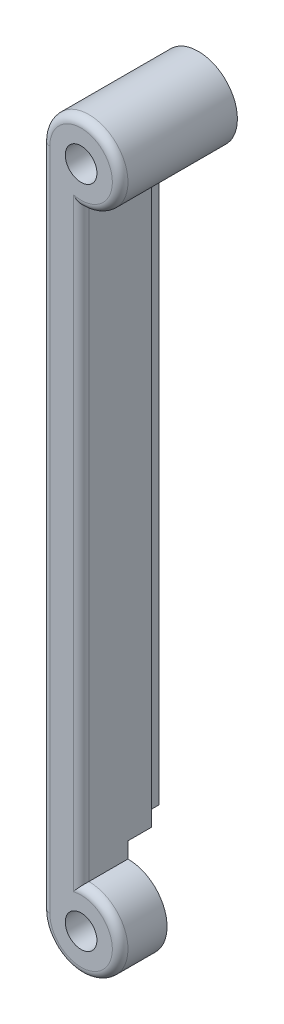
ISO-10303-21;
HEADER;
FILE_DESCRIPTION(('STEP AP214'),'2;1');
FILE_NAME('part.step','',(''),(''),'','','');
FILE_SCHEMA(('AUTOMOTIVE_DESIGN { 1 0 10303 214 1 1 1 1 }'));
ENDSEC;
DATA;
#1=APPLICATION_CONTEXT('core data for automotive mechanical design processes');
#2=APPLICATION_PROTOCOL_DEFINITION('international standard','automotive_design',2000,#1);
#3=PRODUCT_CONTEXT('',#1,'mechanical');
#4=PRODUCT('Part','Part','',(#3));
#5=PRODUCT_RELATED_PRODUCT_CATEGORY('part','',(#4));
#6=PRODUCT_DEFINITION_FORMATION('','',#4);
#7=PRODUCT_DEFINITION_CONTEXT('part definition',#1,'design');
#8=PRODUCT_DEFINITION('design','',#6,#7);
#9=PRODUCT_DEFINITION_SHAPE('','',#8);
#10=(LENGTH_UNIT() NAMED_UNIT(*) SI_UNIT(.MILLI.,.METRE.));
#11=(NAMED_UNIT(*) PLANE_ANGLE_UNIT() SI_UNIT($,.RADIAN.));
#12=(NAMED_UNIT(*) SI_UNIT($,.STERADIAN.) SOLID_ANGLE_UNIT());
#13=UNCERTAINTY_MEASURE_WITH_UNIT(LENGTH_MEASURE(1.E-05),#10,'distance_accuracy_value','');
#14=(GEOMETRIC_REPRESENTATION_CONTEXT(3) GLOBAL_UNCERTAINTY_ASSIGNED_CONTEXT((#13)) GLOBAL_UNIT_ASSIGNED_CONTEXT((#10,
#11,#12)) REPRESENTATION_CONTEXT('',''));
#15=CARTESIAN_POINT('',(0.,0.,0.));
#16=DIRECTION('',(0.,0.,1.));
#17=DIRECTION('',(1.,0.,0.));
#18=AXIS2_PLACEMENT_3D('',#15,#16,#17);
#19=CARTESIAN_POINT('',(0.,85.,9.));
#20=DIRECTION('',(0.,0.,-1.));
#21=DIRECTION('',(-1.,0.,0.));
#22=AXIS2_PLACEMENT_3D('',#19,#20,#21);
#23=CYLINDRICAL_SURFACE('',#22,5.00000000000001);
#24=CARTESIAN_POINT('',(0.,85.,-6.));
#25=DIRECTION('',(0.,0.,1.));
#26=DIRECTION('',(1.,0.,0.));
#27=AXIS2_PLACEMENT_3D('',#24,#25,#26);
#28=CIRCLE('',#27,5.);
#29=CARTESIAN_POINT('',(5.,85.,-6.));
#30=VERTEX_POINT('',#29);
#31=EDGE_CURVE('E176',#30,#30,#28,.T.);
#32=ORIENTED_EDGE('',*,*,#31,.T.);
#33=EDGE_LOOP('',(#32));
#34=FACE_BOUND('',#33,.T.);
#35=DIRECTION('',(0.,0.,-1.));
#36=VECTOR('',#35,1.);
#37=CARTESIAN_POINT('',(-5.,85.,9.));
#38=LINE('',#37,#36);
#39=CARTESIAN_POINT('',(-5.,85.,8.));
#40=VERTEX_POINT('',#39);
#41=CARTESIAN_POINT('',(-5.,85.,-3.));
#42=VERTEX_POINT('',#41);
#43=EDGE_CURVE('E190',#40,#42,#38,.T.);
#44=ORIENTED_EDGE('',*,*,#43,.F.);
#45=CARTESIAN_POINT('',(0.,85.,8.));
#46=DIRECTION('',(0.,0.,1.));
#47=DIRECTION('',(1.,0.,0.));
#48=AXIS2_PLACEMENT_3D('',#45,#46,#47);
#49=CIRCLE('',#48,5.00000000000001);
#50=CARTESIAN_POINT('',(0.,80.,8.));
#51=VERTEX_POINT('',#50);
#52=EDGE_CURVE('E261',#40,#51,#49,.F.);
#53=ORIENTED_EDGE('',*,*,#52,.T.);
#54=DIRECTION('',(0.,0.,-1.));
#55=VECTOR('',#54,1.);
#56=CARTESIAN_POINT('',(0.,80.,9.));
#57=LINE('',#56,#55);
#58=CARTESIAN_POINT('',(0.,80.,-0.999999999999999));
#59=VERTEX_POINT('',#58);
#60=EDGE_CURVE('E192',#51,#59,#57,.T.);
#61=ORIENTED_EDGE('',*,*,#60,.T.);
#62=CARTESIAN_POINT('',(0.,85.,-0.999999999999999));
#63=DIRECTION('',(0.,0.,1.));
#64=DIRECTION('',(1.,0.,0.));
#65=AXIS2_PLACEMENT_3D('',#62,#63,#64);
#66=CIRCLE('',#65,5.00000000000001);
#67=CARTESIAN_POINT('',(-2.,80.4174243050442,-0.999999999999999));
#68=VERTEX_POINT('',#67);
#69=EDGE_CURVE('E207',#59,#68,#66,.F.);
#70=ORIENTED_EDGE('',*,*,#69,.T.);
#71=DIRECTION('',(0.,0.,1.));
#72=VECTOR('',#71,1.);
#73=CARTESIAN_POINT('',(-2.,80.4174243050442,-3.));
#74=LINE('',#73,#72);
#75=CARTESIAN_POINT('',(-2.,80.4174243050442,-3.));
#76=VERTEX_POINT('',#75);
#77=EDGE_CURVE('E170',#76,#68,#74,.T.);
#78=ORIENTED_EDGE('',*,*,#77,.F.);
#79=CARTESIAN_POINT('',(0.,85.,-3.));
#80=DIRECTION('',(0.,0.,-1.));
#81=DIRECTION('',(1.,0.,0.));
#82=AXIS2_PLACEMENT_3D('',#79,#80,#81);
#83=CIRCLE('',#82,5.00000000000001);
#84=EDGE_CURVE('E166',#76,#42,#83,.T.);
#85=ORIENTED_EDGE('',*,*,#84,.T.);
#86=EDGE_LOOP('',(#44,#53,#61,#70,#78,#85));
#87=FACE_BOUND('',#86,.T.);
#88=ADVANCED_FACE('F34',(#34,#87),#23,.T.);
#89=CARTESIAN_POINT('',(0.,0.,9.));
#90=DIRECTION('',(0.,0.,1.));
#91=DIRECTION('',(1.,0.,0.));
#92=AXIS2_PLACEMENT_3D('',#89,#90,#91);
#93=PLANE('',#92);
#94=CARTESIAN_POINT('',(0.,85.,9.));
#95=DIRECTION('',(0.,0.,1.));
#96=DIRECTION('',(1.,0.,0.));
#97=AXIS2_PLACEMENT_3D('',#94,#95,#96);
#98=CIRCLE('',#97,4.00000000000001);
#99=CARTESIAN_POINT('',(-1.,81.1270166537926,9.));
#100=VERTEX_POINT('',#99);
#101=CARTESIAN_POINT('',(-4.00000000000001,85.,9.));
#102=VERTEX_POINT('',#101);
#103=EDGE_CURVE('E268',#100,#102,#98,.T.);
#104=ORIENTED_EDGE('',*,*,#103,.T.);
#105=DIRECTION('',(0.,-1.,0.));
#106=VECTOR('',#105,1.);
#107=CARTESIAN_POINT('',(-4.,0.,9.));
#108=LINE('',#107,#106);
#109=CARTESIAN_POINT('',(-4.,0.,9.));
#110=VERTEX_POINT('',#109);
#111=EDGE_CURVE('E264',#102,#110,#108,.T.);
#112=ORIENTED_EDGE('',*,*,#111,.T.);
#113=CARTESIAN_POINT('',(0.,0.,9.));
#114=DIRECTION('',(0.,0.,1.));
#115=DIRECTION('',(1.,0.,0.));
#116=AXIS2_PLACEMENT_3D('',#113,#114,#115);
#117=CIRCLE('',#116,4.);
#118=CARTESIAN_POINT('',(-1.,3.87298334620742,9.));
#119=VERTEX_POINT('',#118);
#120=EDGE_CURVE('E260',#110,#119,#117,.T.);
#121=ORIENTED_EDGE('',*,*,#120,.T.);
#122=DIRECTION('',(0.,1.,0.));
#123=VECTOR('',#122,1.);
#124=CARTESIAN_POINT('',(-1.,80.,9.));
#125=LINE('',#124,#123);
#126=EDGE_CURVE('E214',#119,#100,#125,.T.);
#127=ORIENTED_EDGE('',*,*,#126,.T.);
#128=EDGE_LOOP('',(#104,#112,#121,#127));
#129=FACE_BOUND('',#128,.T.);
#130=CARTESIAN_POINT('',(0.,85.,9.));
#131=DIRECTION('',(0.,0.,1.));
#132=DIRECTION('',(1.,0.,0.));
#133=AXIS2_PLACEMENT_3D('',#130,#131,#132);
#134=CIRCLE('',#133,2.025);
#135=CARTESIAN_POINT('',(2.025,85.,9.));
#136=VERTEX_POINT('',#135);
#137=EDGE_CURVE('E182',#136,#136,#134,.T.);
#138=ORIENTED_EDGE('',*,*,#137,.F.);
#139=EDGE_LOOP('',(#138));
#140=FACE_BOUND('',#139,.T.);
#141=CARTESIAN_POINT('',(0.,0.,9.));
#142=DIRECTION('',(0.,0.,1.));
#143=DIRECTION('',(1.,0.,0.));
#144=AXIS2_PLACEMENT_3D('',#141,#142,#143);
#145=CIRCLE('',#144,2.025);
#146=CARTESIAN_POINT('',(2.025,0.,9.));
#147=VERTEX_POINT('',#146);
#148=EDGE_CURVE('E179',#147,#147,#145,.T.);
#149=ORIENTED_EDGE('',*,*,#148,.F.);
#150=EDGE_LOOP('',(#149));
#151=FACE_BOUND('',#150,.T.);
#152=ADVANCED_FACE('F271',(#129,#140,#151),#93,.T.);
#153=CARTESIAN_POINT('',(0.,0.,0.));
#154=DIRECTION('',(0.,0.,1.));
#155=DIRECTION('',(1.,0.,0.));
#156=AXIS2_PLACEMENT_3D('',#153,#154,#155);
#157=PLANE('',#156);
#158=DIRECTION('',(-1.,0.,0.));
#159=VECTOR('',#158,1.);
#160=CARTESIAN_POINT('',(0.,7.01125174005379,0.));
#161=LINE('',#160,#159);
#162=CARTESIAN_POINT('',(0.,7.01125174005379,0.));
#163=VERTEX_POINT('',#162);
#164=CARTESIAN_POINT('',(-0.999999999999996,7.01125174005379,0.));
#165=VERTEX_POINT('',#164);
#166=EDGE_CURVE('E156',#163,#165,#161,.T.);
#167=ORIENTED_EDGE('',*,*,#166,.T.);
#168=DIRECTION('',(0.,1.,0.));
#169=VECTOR('',#168,1.);
#170=CARTESIAN_POINT('',(-0.999999999999995,0.,0.));
#171=LINE('',#170,#169);
#172=CARTESIAN_POINT('',(-1.,79.0839202169004,0.));
#173=VERTEX_POINT('',#172);
#174=EDGE_CURVE('E202',#165,#173,#171,.T.);
#175=ORIENTED_EDGE('',*,*,#174,.T.);
#176=CARTESIAN_POINT('',(0.,85.,0.));
#177=DIRECTION('',(0.,0.,1.));
#178=DIRECTION('',(1.,0.,0.));
#179=AXIS2_PLACEMENT_3D('',#176,#177,#178);
#180=CIRCLE('',#179,6.00000000000001);
#181=CARTESIAN_POINT('',(0.,79.,0.));
#182=VERTEX_POINT('',#181);
#183=EDGE_CURVE('E198',#173,#182,#180,.T.);
#184=ORIENTED_EDGE('',*,*,#183,.T.);
#185=DIRECTION('',(0.,1.,0.));
#186=VECTOR('',#185,1.);
#187=CARTESIAN_POINT('',(0.,5.,0.));
#188=LINE('',#187,#186);
#189=EDGE_CURVE('E185',#163,#182,#188,.T.);
#190=ORIENTED_EDGE('',*,*,#189,.F.);
#191=EDGE_LOOP('',(#167,#175,#184,#190));
#192=FACE_BOUND('',#191,.T.);
#193=ADVANCED_FACE('F286',(#192),#157,.F.);
#194=CARTESIAN_POINT('',(0.,0.,9.));
#195=DIRECTION('',(0.,0.,-1.));
#196=DIRECTION('',(-1.,0.,0.));
#197=AXIS2_PLACEMENT_3D('',#194,#195,#196);
#198=CYLINDRICAL_SURFACE('',#197,5.);
#199=DIRECTION('',(0.,0.,-1.));
#200=VECTOR('',#199,1.);
#201=CARTESIAN_POINT('',(0.,5.,9.));
#202=LINE('',#201,#200);
#203=CARTESIAN_POINT('',(0.,5.,8.));
#204=VERTEX_POINT('',#203);
#205=CARTESIAN_POINT('',(0.,5.,3.));
#206=VERTEX_POINT('',#205);
#207=EDGE_CURVE('E194',#204,#206,#202,.T.);
#208=ORIENTED_EDGE('',*,*,#207,.F.);
#209=CARTESIAN_POINT('',(0.,0.,8.));
#210=DIRECTION('',(0.,0.,1.));
#211=DIRECTION('',(1.,0.,0.));
#212=AXIS2_PLACEMENT_3D('',#209,#210,#211);
#213=CIRCLE('',#212,5.);
#214=CARTESIAN_POINT('',(-5.,0.,8.));
#215=VERTEX_POINT('',#214);
#216=EDGE_CURVE('E57',#204,#215,#213,.F.);
#217=ORIENTED_EDGE('',*,*,#216,.T.);
#218=DIRECTION('',(0.,0.,-1.));
#219=VECTOR('',#218,1.);
#220=CARTESIAN_POINT('',(-5.,0.,9.));
#221=LINE('',#220,#219);
#222=CARTESIAN_POINT('',(-5.,0.,3.));
#223=VERTEX_POINT('',#222);
#224=EDGE_CURVE('E188',#215,#223,#221,.T.);
#225=ORIENTED_EDGE('',*,*,#224,.T.);
#226=CARTESIAN_POINT('',(0.,0.,3.));
#227=DIRECTION('',(0.,0.,1.));
#228=DIRECTION('',(0.,-1.,0.));
#229=AXIS2_PLACEMENT_3D('',#226,#227,#228);
#230=CIRCLE('',#229,5.);
#231=EDGE_CURVE('E144',#223,#206,#230,.T.);
#232=ORIENTED_EDGE('',*,*,#231,.T.);
#233=EDGE_LOOP('',(#208,#217,#225,#232));
#234=FACE_BOUND('',#233,.T.);
#235=ADVANCED_FACE('F294',(#234),#198,.T.);
#236=CARTESIAN_POINT('',(0.,5.,9.));
#237=DIRECTION('',(-1.,0.,0.));
#238=DIRECTION('',(0.,0.,1.));
#239=AXIS2_PLACEMENT_3D('',#236,#237,#238);
#240=PLANE('',#239);
#241=ORIENTED_EDGE('',*,*,#60,.F.);
#242=DIRECTION('',(0.,1.,0.));
#243=VECTOR('',#242,1.);
#244=CARTESIAN_POINT('',(0.,5.,8.));
#245=LINE('',#244,#243);
#246=EDGE_CURVE('E11',#51,#204,#245,.F.);
#247=ORIENTED_EDGE('',*,*,#246,.T.);
#248=ORIENTED_EDGE('',*,*,#207,.T.);
#249=DIRECTION('',(0.,1.,0.));
#250=VECTOR('',#249,1.);
#251=CARTESIAN_POINT('',(0.,5.,3.));
#252=LINE('',#251,#250);
#253=CARTESIAN_POINT('',(0.,7.01125174005379,3.));
#254=VERTEX_POINT('',#253);
#255=EDGE_CURVE('E161',#206,#254,#252,.T.);
#256=ORIENTED_EDGE('',*,*,#255,.T.);
#257=DIRECTION('',(0.,0.,-1.));
#258=VECTOR('',#257,1.);
#259=CARTESIAN_POINT('',(0.,7.01125174005379,9.));
#260=LINE('',#259,#258);
#261=EDGE_CURVE('E133',#254,#163,#260,.T.);
#262=ORIENTED_EDGE('',*,*,#261,.T.);
#263=ORIENTED_EDGE('',*,*,#189,.T.);
#264=CARTESIAN_POINT('',(0.,79.,-0.999999999999999));
#265=DIRECTION('',(-1.,0.,0.));
#266=DIRECTION('',(0.,0.,1.));
#267=AXIS2_PLACEMENT_3D('',#264,#265,#266);
#268=CIRCLE('',#267,1.);
#269=EDGE_CURVE('E211',#182,#59,#268,.T.);
#270=ORIENTED_EDGE('',*,*,#269,.T.);
#271=EDGE_LOOP('',(#241,#247,#248,#256,#262,#263,#270));
#272=FACE_BOUND('',#271,.T.);
#273=ADVANCED_FACE('F292',(#272),#240,.F.);
#274=CARTESIAN_POINT('',(-5.,0.,9.));
#275=DIRECTION('',(1.,0.,0.));
#276=DIRECTION('',(0.,1.,0.));
#277=AXIS2_PLACEMENT_3D('',#274,#275,#276);
#278=PLANE('',#277);
#279=ORIENTED_EDGE('',*,*,#224,.F.);
#280=DIRECTION('',(0.,-1.,0.));
#281=VECTOR('',#280,1.);
#282=CARTESIAN_POINT('',(-5.,85.,8.));
#283=LINE('',#282,#281);
#284=EDGE_CURVE('E49',#215,#40,#283,.F.);
#285=ORIENTED_EDGE('',*,*,#284,.T.);
#286=ORIENTED_EDGE('',*,*,#43,.T.);
#287=DIRECTION('',(0.,-1.,0.));
#288=VECTOR('',#287,1.);
#289=CARTESIAN_POINT('',(-5.,0.,-3.));
#290=LINE('',#289,#288);
#291=CARTESIAN_POINT('',(-5.,7.01125174005379,-3.));
#292=VERTEX_POINT('',#291);
#293=EDGE_CURVE('E151',#42,#292,#290,.T.);
#294=ORIENTED_EDGE('',*,*,#293,.T.);
#295=DIRECTION('',(0.,0.,-1.));
#296=VECTOR('',#295,1.);
#297=CARTESIAN_POINT('',(-5.,7.01125174005379,3.));
#298=LINE('',#297,#296);
#299=CARTESIAN_POINT('',(-5.,7.01125174005379,3.));
#300=VERTEX_POINT('',#299);
#301=EDGE_CURVE('E130',#300,#292,#298,.T.);
#302=ORIENTED_EDGE('',*,*,#301,.F.);
#303=DIRECTION('',(0.,1.,0.));
#304=VECTOR('',#303,1.);
#305=CARTESIAN_POINT('',(-5.,7.01125174005379,3.));
#306=LINE('',#305,#304);
#307=EDGE_CURVE('E141',#223,#300,#306,.T.);
#308=ORIENTED_EDGE('',*,*,#307,.F.);
#309=EDGE_LOOP('',(#279,#285,#286,#294,#302,#308));
#310=FACE_BOUND('',#309,.T.);
#311=ADVANCED_FACE('F149',(#310),#278,.F.);
#312=CARTESIAN_POINT('',(0.,85.,9.));
#313=DIRECTION('',(0.,0.,-1.));
#314=DIRECTION('',(-1.,0.,0.));
#315=AXIS2_PLACEMENT_3D('',#312,#313,#314);
#316=CYLINDRICAL_SURFACE('',#315,2.025);
#317=ORIENTED_EDGE('',*,*,#137,.T.);
#318=EDGE_LOOP('',(#317));
#319=FACE_BOUND('',#318,.T.);
#320=CARTESIAN_POINT('',(0.,85.,-6.));
#321=DIRECTION('',(0.,0.,1.));
#322=DIRECTION('',(1.,0.,0.));
#323=AXIS2_PLACEMENT_3D('',#320,#321,#322);
#324=CIRCLE('',#323,2.025);
#325=CARTESIAN_POINT('',(2.025,85.,-6.));
#326=VERTEX_POINT('',#325);
#327=EDGE_CURVE('E173',#326,#326,#324,.T.);
#328=ORIENTED_EDGE('',*,*,#327,.F.);
#329=EDGE_LOOP('',(#328));
#330=FACE_BOUND('',#329,.T.);
#331=ADVANCED_FACE('F333',(#319,#330),#316,.F.);
#332=CARTESIAN_POINT('',(0.,0.,9.));
#333=DIRECTION('',(0.,0.,-1.));
#334=DIRECTION('',(-1.,0.,0.));
#335=AXIS2_PLACEMENT_3D('',#332,#333,#334);
#336=CYLINDRICAL_SURFACE('',#335,2.025);
#337=CARTESIAN_POINT('',(0.,0.,3.));
#338=DIRECTION('',(0.,0.,1.));
#339=DIRECTION('',(0.,-1.,0.));
#340=AXIS2_PLACEMENT_3D('',#337,#338,#339);
#341=CIRCLE('',#340,2.025);
#342=CARTESIAN_POINT('',(0.,-2.025,3.));
#343=VERTEX_POINT('',#342);
#344=EDGE_CURVE('E160',#343,#343,#341,.T.);
#345=ORIENTED_EDGE('',*,*,#344,.F.);
#346=EDGE_LOOP('',(#345));
#347=FACE_BOUND('',#346,.T.);
#348=ORIENTED_EDGE('',*,*,#148,.T.);
#349=EDGE_LOOP('',(#348));
#350=FACE_BOUND('',#349,.T.);
#351=ADVANCED_FACE('F326',(#347,#350),#336,.F.);
#352=CARTESIAN_POINT('',(0.,85.,-6.));
#353=DIRECTION('',(0.,0.,1.));
#354=DIRECTION('',(1.,0.,0.));
#355=AXIS2_PLACEMENT_3D('',#352,#353,#354);
#356=PLANE('',#355);
#357=ORIENTED_EDGE('',*,*,#327,.T.);
#358=EDGE_LOOP('',(#357));
#359=FACE_BOUND('',#358,.T.);
#360=ORIENTED_EDGE('',*,*,#31,.F.);
#361=EDGE_LOOP('',(#360));
#362=FACE_BOUND('',#361,.T.);
#363=ADVANCED_FACE('F319',(#359,#362),#356,.F.);
#364=CARTESIAN_POINT('',(-2.,80.4174243050442,-3.));
#365=DIRECTION('',(1.,0.,0.));
#366=DIRECTION('',(0.,1.,0.));
#367=AXIS2_PLACEMENT_3D('',#364,#365,#366);
#368=PLANE('',#367);
#369=ORIENTED_EDGE('',*,*,#77,.T.);
#370=DIRECTION('',(0.,1.,0.));
#371=VECTOR('',#370,1.);
#372=CARTESIAN_POINT('',(-2.,80.4174243050442,-1.));
#373=LINE('',#372,#371);
#374=CARTESIAN_POINT('',(-2.,7.01125174005379,-1.));
#375=VERTEX_POINT('',#374);
#376=EDGE_CURVE('E205',#68,#375,#373,.F.);
#377=ORIENTED_EDGE('',*,*,#376,.T.);
#378=DIRECTION('',(0.,0.,1.));
#379=VECTOR('',#378,1.);
#380=CARTESIAN_POINT('',(-2.,7.01125174005379,-2.99999999999999));
#381=LINE('',#380,#379);
#382=CARTESIAN_POINT('',(-2.,7.01125174005379,-3.));
#383=VERTEX_POINT('',#382);
#384=EDGE_CURVE('E137',#383,#375,#381,.T.);
#385=ORIENTED_EDGE('',*,*,#384,.F.);
#386=DIRECTION('',(0.,1.,0.));
#387=VECTOR('',#386,1.);
#388=CARTESIAN_POINT('',(-2.,80.4174243050442,-3.));
#389=LINE('',#388,#387);
#390=EDGE_CURVE('E164',#383,#76,#389,.T.);
#391=ORIENTED_EDGE('',*,*,#390,.T.);
#392=EDGE_LOOP('',(#369,#377,#385,#391));
#393=FACE_BOUND('',#392,.T.);
#394=ADVANCED_FACE('F316',(#393),#368,.T.);
#395=CARTESIAN_POINT('',(0.,0.,-3.));
#396=DIRECTION('',(0.,0.,-1.));
#397=DIRECTION('',(-1.,0.,0.));
#398=AXIS2_PLACEMENT_3D('',#395,#396,#397);
#399=PLANE('',#398);
#400=DIRECTION('',(1.,0.,0.));
#401=VECTOR('',#400,1.);
#402=CARTESIAN_POINT('',(0.,7.01125174005379,-3.));
#403=LINE('',#402,#401);
#404=EDGE_CURVE('E196',#292,#383,#403,.T.);
#405=ORIENTED_EDGE('',*,*,#404,.F.);
#406=ORIENTED_EDGE('',*,*,#293,.F.);
#407=ORIENTED_EDGE('',*,*,#84,.F.);
#408=ORIENTED_EDGE('',*,*,#390,.F.);
#409=EDGE_LOOP('',(#405,#406,#407,#408));
#410=FACE_BOUND('',#409,.T.);
#411=ADVANCED_FACE('F311',(#410),#399,.T.);
#412=CARTESIAN_POINT('',(5.,7.01125174005379,3.));
#413=DIRECTION('',(0.,0.,1.));
#414=DIRECTION('',(0.,-1.,0.));
#415=AXIS2_PLACEMENT_3D('',#412,#413,#414);
#416=PLANE('',#415);
#417=ORIENTED_EDGE('',*,*,#344,.T.);
#418=EDGE_LOOP('',(#417));
#419=FACE_BOUND('',#418,.T.);
#420=ORIENTED_EDGE('',*,*,#307,.T.);
#421=DIRECTION('',(-1.,0.,0.));
#422=VECTOR('',#421,1.);
#423=CARTESIAN_POINT('',(5.,7.01125174005379,3.));
#424=LINE('',#423,#422);
#425=EDGE_CURVE('E126',#254,#300,#424,.T.);
#426=ORIENTED_EDGE('',*,*,#425,.F.);
#427=ORIENTED_EDGE('',*,*,#255,.F.);
#428=ORIENTED_EDGE('',*,*,#231,.F.);
#429=EDGE_LOOP('',(#420,#426,#427,#428));
#430=FACE_BOUND('',#429,.T.);
#431=ADVANCED_FACE('F142',(#419,#430),#416,.F.);
#432=CARTESIAN_POINT('',(5.,7.01125174005379,3.));
#433=DIRECTION('',(0.,1.,0.));
#434=DIRECTION('',(0.,0.,1.));
#435=AXIS2_PLACEMENT_3D('',#432,#433,#434);
#436=PLANE('',#435);
#437=ORIENTED_EDGE('',*,*,#425,.T.);
#438=ORIENTED_EDGE('',*,*,#301,.T.);
#439=ORIENTED_EDGE('',*,*,#404,.T.);
#440=ORIENTED_EDGE('',*,*,#384,.T.);
#441=CARTESIAN_POINT('',(-0.999999999999996,7.01125174005379,-1.));
#442=DIRECTION('',(0.,1.,0.));
#443=DIRECTION('',(0.,0.,1.));
#444=AXIS2_PLACEMENT_3D('',#441,#442,#443);
#445=CIRCLE('',#444,1.);
#446=EDGE_CURVE('E209',#375,#165,#445,.T.);
#447=ORIENTED_EDGE('',*,*,#446,.T.);
#448=ORIENTED_EDGE('',*,*,#166,.F.);
#449=ORIENTED_EDGE('',*,*,#261,.F.);
#450=EDGE_LOOP('',(#437,#438,#439,#440,#447,#448,#449));
#451=FACE_BOUND('',#450,.T.);
#452=ADVANCED_FACE('F128',(#451),#436,.F.);
#453=CARTESIAN_POINT('',(0.,85.,-0.999999999999999));
#454=DIRECTION('',(0.,0.,1.));
#455=DIRECTION('',(1.,0.,0.));
#456=AXIS2_PLACEMENT_3D('',#453,#454,#455);
#457=TOROIDAL_SURFACE('',#456,6.00000000000001,1.);
#458=ORIENTED_EDGE('',*,*,#269,.F.);
#459=ORIENTED_EDGE('',*,*,#183,.F.);
#460=CARTESIAN_POINT('',(-2.,80.4174243050442,-1.));
#461=CARTESIAN_POINT('',(-2.00000228424788,80.4174282236585,-0.983453100419111));
#462=CARTESIAN_POINT('',(-1.99958903034137,80.4167965040135,-0.966914972673774));
#463=CARTESIAN_POINT('',(-1.99795445696701,80.4143004887054,-0.933989021202396));
#464=CARTESIAN_POINT('',(-1.99673397662205,80.4124374729929,-0.917601059293226));
#465=CARTESIAN_POINT('',(-1.99193074957981,80.405112183468,-0.869171782092902));
#466=CARTESIAN_POINT('',(-1.98720506956785,80.397911767841,-0.837491825951549));
#467=CARTESIAN_POINT('',(-1.97362987499579,80.3773050224466,-0.76857517142695));
#468=CARTESIAN_POINT('',(-1.96406716233328,80.3628304246547,-0.731807440149403));
#469=CARTESIAN_POINT('',(-1.94167983135816,80.3291577476456,-0.661456655628093));
#470=CARTESIAN_POINT('',(-1.92884064564129,80.3099385865915,-0.627888769310667));
#471=CARTESIAN_POINT('',(-1.89330145667292,80.2571332591771,-0.547408135189379));
#472=CARTESIAN_POINT('',(-1.8689594223389,80.2212954285631,-0.502717824052236));
#473=CARTESIAN_POINT('',(-1.8163463638148,80.1448352537405,-0.420367867845077));
#474=CARTESIAN_POINT('',(-1.78806765842355,80.1042035800471,-0.382722313491828));
#475=CARTESIAN_POINT('',(-1.7335963756065,80.02698418607,-0.319357065541023));
#476=CARTESIAN_POINT('',(-1.70783994964986,79.9908489568555,-0.292695297652713));
#477=CARTESIAN_POINT('',(-1.65470295473653,79.9171344612523,-0.243242943332842));
#478=CARTESIAN_POINT('',(-1.62732133203928,79.8795542636641,-0.220454906363381));
#479=CARTESIAN_POINT('',(-1.54309457872666,79.7652643210207,-0.157394777625828));
#480=CARTESIAN_POINT('',(-1.48421110565825,79.6870672337315,-0.122474994050385));
#481=CARTESIAN_POINT('',(-1.35715208500295,79.5221086743235,-0.063098619751679));
#482=CARTESIAN_POINT('',(-1.28861590387803,79.4352041234952,-0.0398490811592362));
#483=CARTESIAN_POINT('',(-1.14836827284278,79.2615024090387,-0.00847345277910434));
#484=CARTESIAN_POINT('',(-1.07666601118273,79.1747056008631,-0.000306211342973459));
#485=CARTESIAN_POINT('',(-1.00274053560774,79.087163523655,-2.82588910828267E-06));
#486=CARTESIAN_POINT('',(-1.00137041713243,79.0855417108381,-9.21836070862256E-09));
#487=CARTESIAN_POINT('',(-1.,79.0839202169004,0.));
#488=B_SPLINE_CURVE_WITH_KNOTS('',3,(#460,#461,#462,#463,#464,#465,#466,#467,#468,#469,#470,
#471,#472,#473,#474,#475,#476,#477,#478,#479,#480,#481,#482,#483,#484,#485,#486,#487),
.UNSPECIFIED.,.F.,.F.,(4,2,2,2,2,2,2,2,2,2,2,2,2,4),(0.,0.0496072824810394,0.0991630783932773,
0.197170889146333,0.318473571908462,0.440325267112259,0.626017249372654,0.812076767635525,
0.967168992334631,1.12236289771999,1.43301731329403,1.77130559824468,2.10866950101461,
2.11503876135852),.UNSPECIFIED.);
#489=EDGE_CURVE('E146',#68,#173,#488,.T.);
#490=ORIENTED_EDGE('',*,*,#489,.F.);
#491=ORIENTED_EDGE('',*,*,#69,.F.);
#492=EDGE_LOOP('',(#458,#459,#490,#491));
#493=FACE_BOUND('',#492,.T.);
#494=ADVANCED_FACE('F223',(#493),#457,.F.);
#495=CARTESIAN_POINT('',(-0.999999999999995,0.,-1.));
#496=DIRECTION('',(0.,1.,0.));
#497=DIRECTION('',(-1.,0.,0.));
#498=AXIS2_PLACEMENT_3D('',#495,#496,#497);
#499=CYLINDRICAL_SURFACE('',#498,1.);
#500=ORIENTED_EDGE('',*,*,#446,.F.);
#501=ORIENTED_EDGE('',*,*,#376,.F.);
#502=ORIENTED_EDGE('',*,*,#489,.T.);
#503=ORIENTED_EDGE('',*,*,#174,.F.);
#504=EDGE_LOOP('',(#500,#501,#502,#503));
#505=FACE_BOUND('',#504,.T.);
#506=ADVANCED_FACE('F226',(#505),#499,.F.);
#507=CARTESIAN_POINT('',(0.,0.,8.));
#508=DIRECTION('',(0.,0.,1.));
#509=DIRECTION('',(1.,0.,0.));
#510=AXIS2_PLACEMENT_3D('',#507,#508,#509);
#511=TOROIDAL_SURFACE('',#510,4.,1.);
#512=CARTESIAN_POINT('',(-4.,0.,8.));
#513=DIRECTION('',(0.,1.,0.));
#514=DIRECTION('',(0.,0.,1.));
#515=AXIS2_PLACEMENT_3D('',#512,#513,#514);
#516=CIRCLE('',#515,1.);
#517=EDGE_CURVE('E245',#215,#110,#516,.T.);
#518=ORIENTED_EDGE('',*,*,#517,.F.);
#519=ORIENTED_EDGE('',*,*,#216,.F.);
#520=CARTESIAN_POINT('',(0.,5.,8.));
#521=CARTESIAN_POINT('',(2.879463174953E-06,5.00000233218833,8.02223155822927));
#522=CARTESIAN_POINT('',(-0.000742033287419305,4.99925801501361,8.04444969802235));
#523=CARTESIAN_POINT('',(-0.00369346748860565,4.99630550022832,8.08867554657586));
#524=CARTESIAN_POINT('',(-0.00589896793973564,4.99409832520328,8.11068339144558));
#525=CARTESIAN_POINT('',(-0.0146053705874561,4.98537676299928,8.17577677094457));
#526=CARTESIAN_POINT('',(-0.0231975293310297,4.97676113375247,8.21833132249296));
#527=CARTESIAN_POINT('',(-0.0452936501496937,4.95451151498729,8.30058452537815));
#528=CARTESIAN_POINT('',(-0.0587858258776962,4.94088956657933,8.3402897582005));
#529=CARTESIAN_POINT('',(-0.0898489505881418,4.90935431224459,8.41631239743939));
#530=CARTESIAN_POINT('',(-0.10742824682033,4.89143222157751,8.45262265446992));
#531=CARTESIAN_POINT('',(-0.1531115480888,4.84454525595928,8.53454693093529));
#532=CARTESIAN_POINT('',(-0.182672530345869,4.81397567850018,8.5784277698632));
#533=CARTESIAN_POINT('',(-0.245923935306735,4.74782701353902,8.65878319268117));
#534=CARTESIAN_POINT('',(-0.279621632218448,4.7122390846968,8.69524442158242));
#535=CARTESIAN_POINT('',(-0.36428035431052,4.62168806363391,8.77492691856875));
#536=CARTESIAN_POINT('',(-0.4165656467374,4.56484803114034,8.81459452094703));
#537=CARTESIAN_POINT('',(-0.523439767685418,4.44625022487487,8.88140415443155));
#538=CARTESIAN_POINT('',(-0.578032504517048,4.38448393622692,8.90852392175426));
#539=CARTESIAN_POINT('',(-0.693950501653144,4.25035205006903,8.95427963281921));
#540=CARTESIAN_POINT('',(-0.755327216979849,4.17758488487015,8.97157926728396));
#541=CARTESIAN_POINT('',(-0.87687021222261,4.02948837217517,8.99431017187681));
#542=CARTESIAN_POINT('',(-0.937038249147945,3.95416324838232,8.99976012459635));
#543=CARTESIAN_POINT('',(-0.997375506825801,3.87637044635329,8.99999741165446));
#544=CARTESIAN_POINT('',(-0.998688039716482,3.87467708490144,8.99999999324096));
#545=CARTESIAN_POINT('',(-1.,3.87298334620742,9.));
#546=B_SPLINE_CURVE_WITH_KNOTS('',3,(#520,#521,#522,#523,#524,#525,#526,#527,#528,#529,#530,
#531,#532,#533,#534,#535,#536,#537,#538,#539,#540,#541,#542,#543,#544,#545),.UNSPECIFIED.,.F.,
.F.,(4,2,2,2,2,2,2,2,2,2,2,2,4),(0.,0.0666442384215306,0.133241939405098,0.26525836891142,
0.396959330918163,0.528931669980171,0.71123631536925,0.893866254249695,1.15290252975533,
1.41239667053991,1.70176807027958,1.99068290587953,1.99711033823818),.UNSPECIFIED.);
#547=EDGE_CURVE('E39',#119,#204,#546,.F.);
#548=ORIENTED_EDGE('',*,*,#547,.F.);
#549=ORIENTED_EDGE('',*,*,#120,.F.);
#550=EDGE_LOOP('',(#518,#519,#548,#549));
#551=FACE_BOUND('',#550,.T.);
#552=ADVANCED_FACE('F36',(#551),#511,.T.);
#553=CARTESIAN_POINT('',(-1.,0.,8.));
#554=DIRECTION('',(0.,-1.,0.));
#555=DIRECTION('',(0.,0.,-1.));
#556=AXIS2_PLACEMENT_3D('',#553,#554,#555);
#557=CYLINDRICAL_SURFACE('',#556,1.);
#558=ORIENTED_EDGE('',*,*,#547,.T.);
#559=ORIENTED_EDGE('',*,*,#246,.F.);
#560=CARTESIAN_POINT('',(0.,80.,8.));
#561=CARTESIAN_POINT('',(2.87946317500567E-06,79.9999976678117,8.02223155822927));
#562=CARTESIAN_POINT('',(-0.00074203328741916,80.0007419849864,8.04444969802235));
#563=CARTESIAN_POINT('',(-0.0036934674886056,80.0036944997717,8.08867554657587));
#564=CARTESIAN_POINT('',(-0.00589896793973564,80.0059016747967,8.11068339144558));
#565=CARTESIAN_POINT('',(-0.0146053705874561,80.0146232370007,8.17577677094457));
#566=CARTESIAN_POINT('',(-0.0231975293310296,80.0232388662475,8.21833132249295));
#567=CARTESIAN_POINT('',(-0.0452936501496942,80.0454884850127,8.30058452537816));
#568=CARTESIAN_POINT('',(-0.0587858258776974,80.0591104334207,8.34028975820051));
#569=CARTESIAN_POINT('',(-0.0898489505881433,80.0906456877554,8.41631239743939));
#570=CARTESIAN_POINT('',(-0.10742824682033,80.1085677784225,8.45262265446992));
#571=CARTESIAN_POINT('',(-0.1531115480888,80.1554547440407,8.53454693093529));
#572=CARTESIAN_POINT('',(-0.182672530345869,80.1860243214998,8.5784277698632));
#573=CARTESIAN_POINT('',(-0.245923935306735,80.252172986461,8.65878319268117));
#574=CARTESIAN_POINT('',(-0.279621632218448,80.2877609153032,8.69524442158242));
#575=CARTESIAN_POINT('',(-0.364280354310522,80.3783119363661,8.77492691856876));
#576=CARTESIAN_POINT('',(-0.416565646737405,80.4351519688597,8.81459452094703));
#577=CARTESIAN_POINT('',(-0.523439767685426,80.5537497751251,8.88140415443156));
#578=CARTESIAN_POINT('',(-0.578032504517055,80.6155160637731,8.90852392175426));
#579=CARTESIAN_POINT('',(-0.693950501653143,80.749647949931,8.95427963281921));
#580=CARTESIAN_POINT('',(-0.755327216979842,80.8224151151299,8.97157926728396));
#581=CARTESIAN_POINT('',(-0.87687021222263,80.9705116278248,8.99431017187681));
#582=CARTESIAN_POINT('',(-0.937038249147996,81.0458367516177,8.99976012459635));
#583=CARTESIAN_POINT('',(-0.997375506825808,81.1236295536467,8.99999741165446));
#584=CARTESIAN_POINT('',(-0.998688039716486,81.1253229150986,8.99999999324096));
#585=CARTESIAN_POINT('',(-1.,81.1270166537926,9.));
#586=B_SPLINE_CURVE_WITH_KNOTS('',3,(#560,#561,#562,#563,#564,#565,#566,#567,#568,#569,#570,
#571,#572,#573,#574,#575,#576,#577,#578,#579,#580,#581,#582,#583,#584,#585),.UNSPECIFIED.,.F.,
.F.,(4,2,2,2,2,2,2,2,2,2,2,2,4),(0.,0.0666442384215339,0.133241939405098,0.26525836891142,
0.396959330918166,0.528931669980168,0.711236315369255,0.893866254249694,1.15290252975534,
1.41239667053992,1.70176807027958,1.99068290587955,1.99711033823818),.UNSPECIFIED.);
#587=EDGE_CURVE('E239',#100,#51,#586,.F.);
#588=ORIENTED_EDGE('',*,*,#587,.F.);
#589=ORIENTED_EDGE('',*,*,#126,.F.);
#590=EDGE_LOOP('',(#558,#559,#588,#589));
#591=FACE_BOUND('',#590,.T.);
#592=ADVANCED_FACE('F236',(#591),#557,.T.);
#593=CARTESIAN_POINT('',(-4.,0.,8.));
#594=DIRECTION('',(0.,1.,0.));
#595=DIRECTION('',(-1.,0.,0.));
#596=AXIS2_PLACEMENT_3D('',#593,#594,#595);
#597=CYLINDRICAL_SURFACE('',#596,1.);
#598=ORIENTED_EDGE('',*,*,#517,.T.);
#599=ORIENTED_EDGE('',*,*,#111,.F.);
#600=CARTESIAN_POINT('',(-4.,85.,8.));
#601=DIRECTION('',(0.,1.,0.));
#602=DIRECTION('',(0.,0.,1.));
#603=AXIS2_PLACEMENT_3D('',#600,#601,#602);
#604=CIRCLE('',#603,1.);
#605=EDGE_CURVE('E246',#40,#102,#604,.T.);
#606=ORIENTED_EDGE('',*,*,#605,.F.);
#607=ORIENTED_EDGE('',*,*,#284,.F.);
#608=EDGE_LOOP('',(#598,#599,#606,#607));
#609=FACE_BOUND('',#608,.T.);
#610=ADVANCED_FACE('F234',(#609),#597,.T.);
#611=CARTESIAN_POINT('',(0.,85.,8.));
#612=DIRECTION('',(0.,0.,1.));
#613=DIRECTION('',(1.,0.,0.));
#614=AXIS2_PLACEMENT_3D('',#611,#612,#613);
#615=TOROIDAL_SURFACE('',#614,4.00000000000001,1.);
#616=ORIENTED_EDGE('',*,*,#587,.T.);
#617=ORIENTED_EDGE('',*,*,#52,.F.);
#618=ORIENTED_EDGE('',*,*,#605,.T.);
#619=ORIENTED_EDGE('',*,*,#103,.F.);
#620=EDGE_LOOP('',(#616,#617,#618,#619));
#621=FACE_BOUND('',#620,.T.);
#622=ADVANCED_FACE('F231',(#621),#615,.T.);
#623=CLOSED_SHELL('',(#88,#152,#193,#235,#273,#311,#331,#351,#363,#394,#411,#431,#452,#494,#506,
#552,#592,#610,#622));
#624=MANIFOLD_SOLID_BREP('B2',#623);
#625=ADVANCED_BREP_SHAPE_REPRESENTATION('',(#18,#624),#14);
#626=SHAPE_DEFINITION_REPRESENTATION(#9,#625);
ENDSEC;
END-ISO-10303-21;
